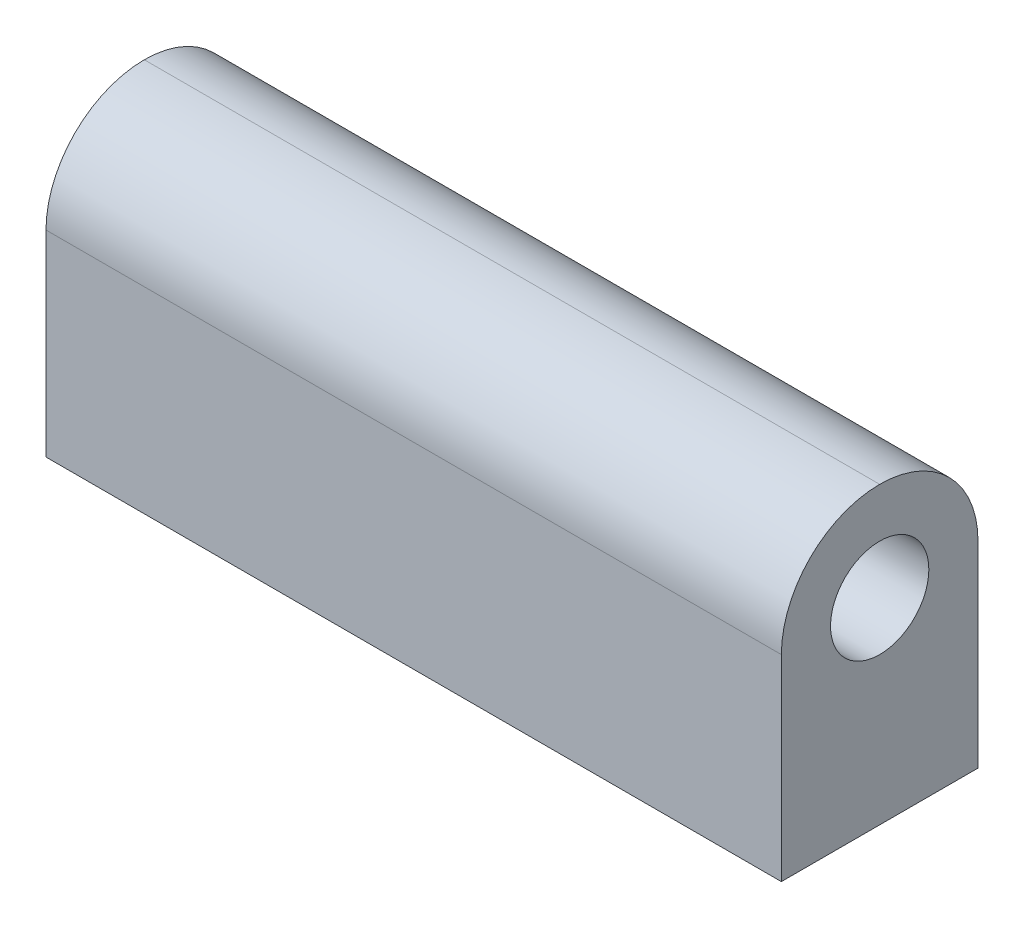
ISO-10303-21;
HEADER;
FILE_DESCRIPTION(('STEP AP214'),'2;1');
FILE_NAME('part.step','',(''),(''),'','','');
FILE_SCHEMA(('AUTOMOTIVE_DESIGN { 1 0 10303 214 1 1 1 1 }'));
ENDSEC;
DATA;
#1=APPLICATION_CONTEXT('core data for automotive mechanical design processes');
#2=APPLICATION_PROTOCOL_DEFINITION('international standard','automotive_design',2000,#1);
#3=PRODUCT_CONTEXT('',#1,'mechanical');
#4=PRODUCT('Part','Part','',(#3));
#5=PRODUCT_RELATED_PRODUCT_CATEGORY('part','',(#4));
#6=PRODUCT_DEFINITION_FORMATION('','',#4);
#7=PRODUCT_DEFINITION_CONTEXT('part definition',#1,'design');
#8=PRODUCT_DEFINITION('design','',#6,#7);
#9=PRODUCT_DEFINITION_SHAPE('','',#8);
#10=(LENGTH_UNIT() NAMED_UNIT(*) SI_UNIT(.MILLI.,.METRE.));
#11=(NAMED_UNIT(*) PLANE_ANGLE_UNIT() SI_UNIT($,.RADIAN.));
#12=(NAMED_UNIT(*) SI_UNIT($,.STERADIAN.) SOLID_ANGLE_UNIT());
#13=UNCERTAINTY_MEASURE_WITH_UNIT(LENGTH_MEASURE(1.E-05),#10,'distance_accuracy_value','');
#14=(GEOMETRIC_REPRESENTATION_CONTEXT(3) GLOBAL_UNCERTAINTY_ASSIGNED_CONTEXT((#13)) GLOBAL_UNIT_ASSIGNED_CONTEXT((#10,
#11,#12)) REPRESENTATION_CONTEXT('',''));
#15=CARTESIAN_POINT('',(0.,0.,0.));
#16=DIRECTION('',(0.,0.,1.));
#17=DIRECTION('',(1.,0.,0.));
#18=AXIS2_PLACEMENT_3D('',#15,#16,#17);
#19=CARTESIAN_POINT('',(18.7,15.,5.));
#20=DIRECTION('',(-1.,0.,0.));
#21=DIRECTION('',(0.,0.,1.));
#22=AXIS2_PLACEMENT_3D('',#19,#20,#21);
#23=PLANE('',#22);
#24=CARTESIAN_POINT('',(18.7,10.,0.));
#25=DIRECTION('',(1.,0.,0.));
#26=DIRECTION('',(0.,0.,-1.));
#27=AXIS2_PLACEMENT_3D('',#24,#25,#26);
#28=CIRCLE('',#27,2.5);
#29=CARTESIAN_POINT('',(18.7,10.,-2.5));
#30=VERTEX_POINT('',#29);
#31=EDGE_CURVE('E119',#30,#30,#28,.T.);
#32=ORIENTED_EDGE('',*,*,#31,.F.);
#33=EDGE_LOOP('',(#32));
#34=FACE_BOUND('',#33,.T.);
#35=DIRECTION('',(0.,-1.,0.));
#36=VECTOR('',#35,1.);
#37=CARTESIAN_POINT('',(18.7,15.,-5.));
#38=LINE('',#37,#36);
#39=CARTESIAN_POINT('',(18.7,10.,-5.));
#40=VERTEX_POINT('',#39);
#41=CARTESIAN_POINT('',(18.7,0.,-5.));
#42=VERTEX_POINT('',#41);
#43=EDGE_CURVE('E176',#40,#42,#38,.T.);
#44=ORIENTED_EDGE('',*,*,#43,.F.);
#45=CARTESIAN_POINT('',(18.7,10.,0.));
#46=DIRECTION('',(-1.,0.,0.));
#47=DIRECTION('',(0.,0.,1.));
#48=AXIS2_PLACEMENT_3D('',#45,#46,#47);
#49=CIRCLE('',#48,5.);
#50=CARTESIAN_POINT('',(18.7,15.,0.));
#51=VERTEX_POINT('',#50);
#52=EDGE_CURVE('E49',#40,#51,#49,.F.);
#53=ORIENTED_EDGE('',*,*,#52,.T.);
#54=CARTESIAN_POINT('',(18.7,10.,0.));
#55=DIRECTION('',(-1.,0.,0.));
#56=DIRECTION('',(0.,0.,1.));
#57=AXIS2_PLACEMENT_3D('',#54,#55,#56);
#58=CIRCLE('',#57,5.);
#59=CARTESIAN_POINT('',(18.7,10.,5.));
#60=VERTEX_POINT('',#59);
#61=EDGE_CURVE('E56',#51,#60,#58,.F.);
#62=ORIENTED_EDGE('',*,*,#61,.T.);
#63=DIRECTION('',(0.,-1.,0.));
#64=VECTOR('',#63,1.);
#65=CARTESIAN_POINT('',(18.7,15.,5.));
#66=LINE('',#65,#64);
#67=CARTESIAN_POINT('',(18.7,0.,5.));
#68=VERTEX_POINT('',#67);
#69=EDGE_CURVE('E167',#60,#68,#66,.T.);
#70=ORIENTED_EDGE('',*,*,#69,.T.);
#71=DIRECTION('',(0.,0.,-1.));
#72=VECTOR('',#71,1.);
#73=CARTESIAN_POINT('',(18.7,0.,5.));
#74=LINE('',#73,#72);
#75=EDGE_CURVE('E151',#68,#42,#74,.T.);
#76=ORIENTED_EDGE('',*,*,#75,.T.);
#77=EDGE_LOOP('',(#44,#53,#62,#70,#76));
#78=FACE_BOUND('',#77,.T.);
#79=ADVANCED_FACE('F39',(#34,#78),#23,.F.);
#80=CARTESIAN_POINT('',(-18.7,15.,-5.));
#81=DIRECTION('',(0.,0.,1.));
#82=DIRECTION('',(1.,0.,0.));
#83=AXIS2_PLACEMENT_3D('',#80,#81,#82);
#84=PLANE('',#83);
#85=DIRECTION('',(0.,-1.,0.));
#86=VECTOR('',#85,1.);
#87=CARTESIAN_POINT('',(-18.7,15.,-5.));
#88=LINE('',#87,#86);
#89=CARTESIAN_POINT('',(-18.7,10.,-5.));
#90=VERTEX_POINT('',#89);
#91=CARTESIAN_POINT('',(-18.7,0.,-5.));
#92=VERTEX_POINT('',#91);
#93=EDGE_CURVE('E173',#90,#92,#88,.T.);
#94=ORIENTED_EDGE('',*,*,#93,.F.);
#95=DIRECTION('',(-1.,0.,0.));
#96=VECTOR('',#95,1.);
#97=CARTESIAN_POINT('',(-18.7,10.,-5.));
#98=LINE('',#97,#96);
#99=EDGE_CURVE('E185',#90,#40,#98,.F.);
#100=ORIENTED_EDGE('',*,*,#99,.T.);
#101=ORIENTED_EDGE('',*,*,#43,.T.);
#102=DIRECTION('',(-1.,0.,0.));
#103=VECTOR('',#102,1.);
#104=CARTESIAN_POINT('',(-18.7,0.,-5.));
#105=LINE('',#104,#103);
#106=EDGE_CURVE('E155',#42,#92,#105,.T.);
#107=ORIENTED_EDGE('',*,*,#106,.T.);
#108=EDGE_LOOP('',(#94,#100,#101,#107));
#109=FACE_BOUND('',#108,.T.);
#110=ADVANCED_FACE('F215',(#109),#84,.F.);
#111=CARTESIAN_POINT('',(-18.7,15.,5.));
#112=DIRECTION('',(1.,0.,0.));
#113=DIRECTION('',(0.,0.,-1.));
#114=AXIS2_PLACEMENT_3D('',#111,#112,#113);
#115=PLANE('',#114);
#116=CARTESIAN_POINT('',(-18.7,10.,0.));
#117=DIRECTION('',(-1.,0.,0.));
#118=DIRECTION('',(0.,0.,1.));
#119=AXIS2_PLACEMENT_3D('',#116,#117,#118);
#120=CIRCLE('',#119,2.5);
#121=CARTESIAN_POINT('',(-18.7,10.,2.5));
#122=VERTEX_POINT('',#121);
#123=EDGE_CURVE('E135',#122,#122,#120,.T.);
#124=ORIENTED_EDGE('',*,*,#123,.F.);
#125=EDGE_LOOP('',(#124));
#126=FACE_BOUND('',#125,.T.);
#127=CARTESIAN_POINT('',(-18.7,10.,0.));
#128=DIRECTION('',(1.,0.,0.));
#129=DIRECTION('',(0.,0.,-1.));
#130=AXIS2_PLACEMENT_3D('',#127,#128,#129);
#131=CIRCLE('',#130,5.);
#132=CARTESIAN_POINT('',(-18.7,10.,5.));
#133=VERTEX_POINT('',#132);
#134=CARTESIAN_POINT('',(-18.7,15.,0.));
#135=VERTEX_POINT('',#134);
#136=EDGE_CURVE('E179',#133,#135,#131,.F.);
#137=ORIENTED_EDGE('',*,*,#136,.T.);
#138=CARTESIAN_POINT('',(-18.7,10.,0.));
#139=DIRECTION('',(1.,0.,0.));
#140=DIRECTION('',(0.,0.,-1.));
#141=AXIS2_PLACEMENT_3D('',#138,#139,#140);
#142=CIRCLE('',#141,5.);
#143=EDGE_CURVE('E182',#135,#90,#142,.F.);
#144=ORIENTED_EDGE('',*,*,#143,.T.);
#145=ORIENTED_EDGE('',*,*,#93,.T.);
#146=DIRECTION('',(0.,0.,1.));
#147=VECTOR('',#146,1.);
#148=CARTESIAN_POINT('',(-18.7,0.,5.));
#149=LINE('',#148,#147);
#150=CARTESIAN_POINT('',(-18.7,0.,5.));
#151=VERTEX_POINT('',#150);
#152=EDGE_CURVE('E159',#92,#151,#149,.T.);
#153=ORIENTED_EDGE('',*,*,#152,.T.);
#154=DIRECTION('',(0.,-1.,0.));
#155=VECTOR('',#154,1.);
#156=CARTESIAN_POINT('',(-18.7,15.,5.));
#157=LINE('',#156,#155);
#158=EDGE_CURVE('E170',#133,#151,#157,.T.);
#159=ORIENTED_EDGE('',*,*,#158,.F.);
#160=EDGE_LOOP('',(#137,#144,#145,#153,#159));
#161=FACE_BOUND('',#160,.T.);
#162=ADVANCED_FACE('F206',(#126,#161),#115,.F.);
#163=CARTESIAN_POINT('',(-18.7,15.,5.));
#164=DIRECTION('',(0.,0.,-1.));
#165=DIRECTION('',(-1.,0.,0.));
#166=AXIS2_PLACEMENT_3D('',#163,#164,#165);
#167=PLANE('',#166);
#168=ORIENTED_EDGE('',*,*,#69,.F.);
#169=DIRECTION('',(1.,0.,0.));
#170=VECTOR('',#169,1.);
#171=CARTESIAN_POINT('',(-18.7,10.,5.));
#172=LINE('',#171,#170);
#173=EDGE_CURVE('E11',#60,#133,#172,.F.);
#174=ORIENTED_EDGE('',*,*,#173,.T.);
#175=ORIENTED_EDGE('',*,*,#158,.T.);
#176=DIRECTION('',(1.,0.,0.));
#177=VECTOR('',#176,1.);
#178=CARTESIAN_POINT('',(-18.7,0.,5.));
#179=LINE('',#178,#177);
#180=EDGE_CURVE('E163',#151,#68,#179,.T.);
#181=ORIENTED_EDGE('',*,*,#180,.T.);
#182=EDGE_LOOP('',(#168,#174,#175,#181));
#183=FACE_BOUND('',#182,.T.);
#184=ADVANCED_FACE('F204',(#183),#167,.F.);
#185=CARTESIAN_POINT('',(0.,0.,0.));
#186=DIRECTION('',(0.,-1.,0.));
#187=DIRECTION('',(0.,0.,-1.));
#188=AXIS2_PLACEMENT_3D('',#185,#186,#187);
#189=PLANE('',#188);
#190=CARTESIAN_POINT('',(5.,0.,0.));
#191=DIRECTION('',(0.,-1.,0.));
#192=DIRECTION('',(0.,0.,-1.));
#193=AXIS2_PLACEMENT_3D('',#190,#191,#192);
#194=CIRCLE('',#193,2.5);
#195=CARTESIAN_POINT('',(5.,0.,-2.5));
#196=VERTEX_POINT('',#195);
#197=EDGE_CURVE('E106',#196,#196,#194,.T.);
#198=ORIENTED_EDGE('',*,*,#197,.F.);
#199=EDGE_LOOP('',(#198));
#200=FACE_BOUND('',#199,.T.);
#201=CARTESIAN_POINT('',(-5.,0.,0.));
#202=DIRECTION('',(0.,-1.,0.));
#203=DIRECTION('',(0.,0.,-1.));
#204=AXIS2_PLACEMENT_3D('',#201,#202,#203);
#205=CIRCLE('',#204,2.5);
#206=CARTESIAN_POINT('',(-5.,0.,-2.5));
#207=VERTEX_POINT('',#206);
#208=EDGE_CURVE('E105',#207,#207,#205,.T.);
#209=ORIENTED_EDGE('',*,*,#208,.F.);
#210=EDGE_LOOP('',(#209));
#211=FACE_BOUND('',#210,.T.);
#212=ORIENTED_EDGE('',*,*,#75,.F.);
#213=ORIENTED_EDGE('',*,*,#180,.F.);
#214=ORIENTED_EDGE('',*,*,#152,.F.);
#215=ORIENTED_EDGE('',*,*,#106,.F.);
#216=EDGE_LOOP('',(#212,#213,#214,#215));
#217=FACE_BOUND('',#216,.T.);
#218=ADVANCED_FACE('F213',(#200,#211,#217),#189,.T.);
#219=CARTESIAN_POINT('',(0.,10.,0.));
#220=DIRECTION('',(1.,0.,0.));
#221=DIRECTION('',(0.,0.,-1.));
#222=AXIS2_PLACEMENT_3D('',#219,#220,#221);
#223=CYLINDRICAL_SURFACE('',#222,5.);
#224=ORIENTED_EDGE('',*,*,#173,.F.);
#225=ORIENTED_EDGE('',*,*,#61,.F.);
#226=DIRECTION('',(1.,0.,0.));
#227=VECTOR('',#226,1.);
#228=CARTESIAN_POINT('',(0.,15.,0.));
#229=LINE('',#228,#227);
#230=EDGE_CURVE('E43',#135,#51,#229,.T.);
#231=ORIENTED_EDGE('',*,*,#230,.F.);
#232=ORIENTED_EDGE('',*,*,#136,.F.);
#233=EDGE_LOOP('',(#224,#225,#231,#232));
#234=FACE_BOUND('',#233,.T.);
#235=ADVANCED_FACE('F41',(#234),#223,.T.);
#236=CARTESIAN_POINT('',(0.,10.,0.));
#237=DIRECTION('',(-1.,0.,0.));
#238=DIRECTION('',(0.,0.,1.));
#239=AXIS2_PLACEMENT_3D('',#236,#237,#238);
#240=CYLINDRICAL_SURFACE('',#239,5.);
#241=ORIENTED_EDGE('',*,*,#52,.F.);
#242=ORIENTED_EDGE('',*,*,#99,.F.);
#243=ORIENTED_EDGE('',*,*,#143,.F.);
#244=ORIENTED_EDGE('',*,*,#230,.T.);
#245=EDGE_LOOP('',(#241,#242,#243,#244));
#246=FACE_BOUND('',#245,.T.);
#247=ADVANCED_FACE('F197',(#246),#240,.T.);
#248=CARTESIAN_POINT('',(-8.7,10.,0.));
#249=DIRECTION('',(-1.,0.,0.));
#250=DIRECTION('',(0.,0.,1.));
#251=AXIS2_PLACEMENT_3D('',#248,#249,#250);
#252=CONICAL_SURFACE('',#251,2.25,1.02974425867665);
#253=CARTESIAN_POINT('',(-7.34806360718799,9.99999999999999,0.));
#254=VERTEX_POINT('',#253);
#255=VERTEX_LOOP('',#254);
#256=FACE_BOUND('',#255,.T.);
#257=CARTESIAN_POINT('',(-8.7,10.,0.));
#258=DIRECTION('',(-1.,0.,0.));
#259=DIRECTION('',(0.,0.,1.));
#260=AXIS2_PLACEMENT_3D('',#257,#258,#259);
#261=CIRCLE('',#260,2.25);
#262=CARTESIAN_POINT('',(-8.7,10.,2.25));
#263=VERTEX_POINT('',#262);
#264=EDGE_CURVE('E147',#263,#263,#261,.T.);
#265=ORIENTED_EDGE('',*,*,#264,.T.);
#266=EDGE_LOOP('',(#265));
#267=FACE_BOUND('',#266,.T.);
#268=ADVANCED_FACE('F228',(#256,#267),#252,.F.);
#269=CARTESIAN_POINT('',(-18.7,10.,0.));
#270=DIRECTION('',(-1.,0.,0.));
#271=DIRECTION('',(0.,0.,1.));
#272=AXIS2_PLACEMENT_3D('',#269,#270,#271);
#273=CYLINDRICAL_SURFACE('',#272,2.25);
#274=ORIENTED_EDGE('',*,*,#264,.F.);
#275=EDGE_LOOP('',(#274));
#276=FACE_BOUND('',#275,.T.);
#277=CARTESIAN_POINT('',(-10.7,10.,0.));
#278=DIRECTION('',(-1.,0.,0.));
#279=DIRECTION('',(0.,0.,1.));
#280=AXIS2_PLACEMENT_3D('',#277,#278,#279);
#281=CIRCLE('',#280,2.25);
#282=CARTESIAN_POINT('',(-10.7,10.,2.25));
#283=VERTEX_POINT('',#282);
#284=EDGE_CURVE('E143',#283,#283,#281,.T.);
#285=ORIENTED_EDGE('',*,*,#284,.T.);
#286=EDGE_LOOP('',(#285));
#287=FACE_BOUND('',#286,.T.);
#288=ADVANCED_FACE('F233',(#276,#287),#273,.F.);
#289=CARTESIAN_POINT('',(-10.7,12.25,0.));
#290=DIRECTION('',(1.,0.,0.));
#291=DIRECTION('',(0.,0.,-1.));
#292=AXIS2_PLACEMENT_3D('',#289,#290,#291);
#293=PLANE('',#292);
#294=ORIENTED_EDGE('',*,*,#284,.F.);
#295=EDGE_LOOP('',(#294));
#296=FACE_BOUND('',#295,.T.);
#297=CARTESIAN_POINT('',(-10.7,10.,0.));
#298=DIRECTION('',(-1.,0.,0.));
#299=DIRECTION('',(0.,0.,1.));
#300=AXIS2_PLACEMENT_3D('',#297,#298,#299);
#301=CIRCLE('',#300,2.5);
#302=CARTESIAN_POINT('',(-10.7,10.,2.5));
#303=VERTEX_POINT('',#302);
#304=EDGE_CURVE('E139',#303,#303,#301,.T.);
#305=ORIENTED_EDGE('',*,*,#304,.T.);
#306=EDGE_LOOP('',(#305));
#307=FACE_BOUND('',#306,.T.);
#308=ADVANCED_FACE('F249',(#296,#307),#293,.F.);
#309=CARTESIAN_POINT('',(-18.7,10.,0.));
#310=DIRECTION('',(-1.,0.,0.));
#311=DIRECTION('',(0.,0.,1.));
#312=AXIS2_PLACEMENT_3D('',#309,#310,#311);
#313=CYLINDRICAL_SURFACE('',#312,2.5);
#314=ORIENTED_EDGE('',*,*,#304,.F.);
#315=EDGE_LOOP('',(#314));
#316=FACE_BOUND('',#315,.T.);
#317=ORIENTED_EDGE('',*,*,#123,.T.);
#318=EDGE_LOOP('',(#317));
#319=FACE_BOUND('',#318,.T.);
#320=ADVANCED_FACE('F253',(#316,#319),#313,.F.);
#321=CARTESIAN_POINT('',(8.7,10.,0.));
#322=DIRECTION('',(1.,0.,0.));
#323=DIRECTION('',(0.,0.,-1.));
#324=AXIS2_PLACEMENT_3D('',#321,#322,#323);
#325=CONICAL_SURFACE('',#324,2.25,1.02974425867665);
#326=CARTESIAN_POINT('',(7.34806360718799,9.99999999999999,0.));
#327=VERTEX_POINT('',#326);
#328=VERTEX_LOOP('',#327);
#329=FACE_BOUND('',#328,.T.);
#330=CARTESIAN_POINT('',(8.7,10.,0.));
#331=DIRECTION('',(1.,0.,0.));
#332=DIRECTION('',(0.,0.,-1.));
#333=AXIS2_PLACEMENT_3D('',#330,#331,#332);
#334=CIRCLE('',#333,2.25);
#335=CARTESIAN_POINT('',(8.7,10.,-2.25));
#336=VERTEX_POINT('',#335);
#337=EDGE_CURVE('E131',#336,#336,#334,.T.);
#338=ORIENTED_EDGE('',*,*,#337,.T.);
#339=EDGE_LOOP('',(#338));
#340=FACE_BOUND('',#339,.T.);
#341=ADVANCED_FACE('F257',(#329,#340),#325,.F.);
#342=CARTESIAN_POINT('',(18.7,10.,0.));
#343=DIRECTION('',(1.,0.,0.));
#344=DIRECTION('',(0.,0.,-1.));
#345=AXIS2_PLACEMENT_3D('',#342,#343,#344);
#346=CYLINDRICAL_SURFACE('',#345,2.25);
#347=ORIENTED_EDGE('',*,*,#337,.F.);
#348=EDGE_LOOP('',(#347));
#349=FACE_BOUND('',#348,.T.);
#350=CARTESIAN_POINT('',(10.7,10.,0.));
#351=DIRECTION('',(1.,0.,0.));
#352=DIRECTION('',(0.,0.,-1.));
#353=AXIS2_PLACEMENT_3D('',#350,#351,#352);
#354=CIRCLE('',#353,2.25);
#355=CARTESIAN_POINT('',(10.7,10.,-2.25));
#356=VERTEX_POINT('',#355);
#357=EDGE_CURVE('E127',#356,#356,#354,.T.);
#358=ORIENTED_EDGE('',*,*,#357,.T.);
#359=EDGE_LOOP('',(#358));
#360=FACE_BOUND('',#359,.T.);
#361=ADVANCED_FACE('F261',(#349,#360),#346,.F.);
#362=CARTESIAN_POINT('',(10.7,12.25,0.));
#363=DIRECTION('',(-1.,0.,0.));
#364=DIRECTION('',(0.,0.,1.));
#365=AXIS2_PLACEMENT_3D('',#362,#363,#364);
#366=PLANE('',#365);
#367=ORIENTED_EDGE('',*,*,#357,.F.);
#368=EDGE_LOOP('',(#367));
#369=FACE_BOUND('',#368,.T.);
#370=CARTESIAN_POINT('',(10.7,10.,0.));
#371=DIRECTION('',(1.,0.,0.));
#372=DIRECTION('',(0.,0.,-1.));
#373=AXIS2_PLACEMENT_3D('',#370,#371,#372);
#374=CIRCLE('',#373,2.5);
#375=CARTESIAN_POINT('',(10.7,10.,-2.5));
#376=VERTEX_POINT('',#375);
#377=EDGE_CURVE('E123',#376,#376,#374,.T.);
#378=ORIENTED_EDGE('',*,*,#377,.T.);
#379=EDGE_LOOP('',(#378));
#380=FACE_BOUND('',#379,.T.);
#381=ADVANCED_FACE('F265',(#369,#380),#366,.F.);
#382=CARTESIAN_POINT('',(18.7,10.,0.));
#383=DIRECTION('',(1.,0.,0.));
#384=DIRECTION('',(0.,0.,-1.));
#385=AXIS2_PLACEMENT_3D('',#382,#383,#384);
#386=CYLINDRICAL_SURFACE('',#385,2.5);
#387=ORIENTED_EDGE('',*,*,#377,.F.);
#388=EDGE_LOOP('',(#387));
#389=FACE_BOUND('',#388,.T.);
#390=ORIENTED_EDGE('',*,*,#31,.T.);
#391=EDGE_LOOP('',(#390));
#392=FACE_BOUND('',#391,.T.);
#393=ADVANCED_FACE('F269',(#389,#392),#386,.F.);
#394=CARTESIAN_POINT('',(-5.,4.2,0.));
#395=DIRECTION('',(0.,-1.,0.));
#396=DIRECTION('',(0.,0.,-1.));
#397=AXIS2_PLACEMENT_3D('',#394,#395,#396);
#398=CONICAL_SURFACE('',#397,2.5,1.02974425867665);
#399=CARTESIAN_POINT('',(-5.,5.7021515475689,0.));
#400=VERTEX_POINT('',#399);
#401=VERTEX_LOOP('',#400);
#402=FACE_BOUND('',#401,.T.);
#403=CARTESIAN_POINT('',(-5.,4.2,0.));
#404=DIRECTION('',(0.,-1.,0.));
#405=DIRECTION('',(0.,0.,-1.));
#406=AXIS2_PLACEMENT_3D('',#403,#404,#405);
#407=CIRCLE('',#406,2.5);
#408=CARTESIAN_POINT('',(-5.,4.2,-2.5));
#409=VERTEX_POINT('',#408);
#410=EDGE_CURVE('E111',#409,#409,#407,.T.);
#411=ORIENTED_EDGE('',*,*,#410,.T.);
#412=EDGE_LOOP('',(#411));
#413=FACE_BOUND('',#412,.T.);
#414=ADVANCED_FACE('F273',(#402,#413),#398,.F.);
#415=CARTESIAN_POINT('',(-5.,0.,0.));
#416=DIRECTION('',(0.,-1.,0.));
#417=DIRECTION('',(0.,0.,-1.));
#418=AXIS2_PLACEMENT_3D('',#415,#416,#417);
#419=CYLINDRICAL_SURFACE('',#418,2.5);
#420=ORIENTED_EDGE('',*,*,#410,.F.);
#421=EDGE_LOOP('',(#420));
#422=FACE_BOUND('',#421,.T.);
#423=ORIENTED_EDGE('',*,*,#208,.T.);
#424=EDGE_LOOP('',(#423));
#425=FACE_BOUND('',#424,.T.);
#426=ADVANCED_FACE('F98',(#422,#425),#419,.F.);
#427=CARTESIAN_POINT('',(5.,4.2,0.));
#428=DIRECTION('',(0.,-1.,0.));
#429=DIRECTION('',(0.,0.,-1.));
#430=AXIS2_PLACEMENT_3D('',#427,#428,#429);
#431=CONICAL_SURFACE('',#430,2.5,1.02974425867665);
#432=CARTESIAN_POINT('',(5.,5.7021515475689,0.));
#433=VERTEX_POINT('',#432);
#434=VERTEX_LOOP('',#433);
#435=FACE_BOUND('',#434,.T.);
#436=CARTESIAN_POINT('',(5.,4.2,0.));
#437=DIRECTION('',(0.,-1.,0.));
#438=DIRECTION('',(0.,0.,-1.));
#439=AXIS2_PLACEMENT_3D('',#436,#437,#438);
#440=CIRCLE('',#439,2.5);
#441=CARTESIAN_POINT('',(5.,4.2,-2.5));
#442=VERTEX_POINT('',#441);
#443=EDGE_CURVE('E102',#442,#442,#440,.T.);
#444=ORIENTED_EDGE('',*,*,#443,.T.);
#445=EDGE_LOOP('',(#444));
#446=FACE_BOUND('',#445,.T.);
#447=ADVANCED_FACE('F94',(#435,#446),#431,.F.);
#448=CARTESIAN_POINT('',(5.,0.,0.));
#449=DIRECTION('',(0.,-1.,0.));
#450=DIRECTION('',(0.,0.,-1.));
#451=AXIS2_PLACEMENT_3D('',#448,#449,#450);
#452=CYLINDRICAL_SURFACE('',#451,2.5);
#453=ORIENTED_EDGE('',*,*,#443,.F.);
#454=EDGE_LOOP('',(#453));
#455=FACE_BOUND('',#454,.T.);
#456=ORIENTED_EDGE('',*,*,#197,.T.);
#457=EDGE_LOOP('',(#456));
#458=FACE_BOUND('',#457,.T.);
#459=ADVANCED_FACE('F97',(#455,#458),#452,.F.);
#460=CLOSED_SHELL('',(#79,#110,#162,#184,#218,#235,#247,#268,#288,#308,#320,#341,#361,#381,#393,
#414,#426,#447,#459));
#461=MANIFOLD_SOLID_BREP('B2',#460);
#462=ADVANCED_BREP_SHAPE_REPRESENTATION('',(#18,#461),#14);
#463=SHAPE_DEFINITION_REPRESENTATION(#9,#462);
ENDSEC;
END-ISO-10303-21;
